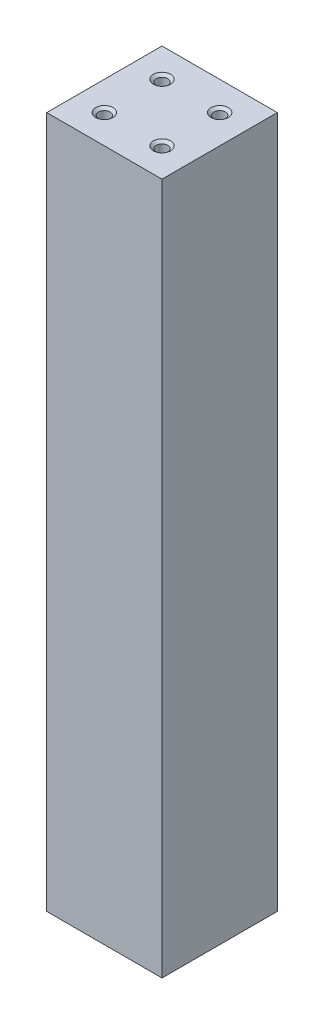
ISO-10303-21;
HEADER;
FILE_DESCRIPTION(('STEP AP214'),'2;1');
FILE_NAME('part.step','',(''),(''),'','','');
FILE_SCHEMA(('AUTOMOTIVE_DESIGN { 1 0 10303 214 1 1 1 1 }'));
ENDSEC;
DATA;
#1=APPLICATION_CONTEXT('core data for automotive mechanical design processes');
#2=APPLICATION_PROTOCOL_DEFINITION('international standard','automotive_design',2000,#1);
#3=PRODUCT_CONTEXT('',#1,'mechanical');
#4=PRODUCT('Part','Part','',(#3));
#5=PRODUCT_RELATED_PRODUCT_CATEGORY('part','',(#4));
#6=PRODUCT_DEFINITION_FORMATION('','',#4);
#7=PRODUCT_DEFINITION_CONTEXT('part definition',#1,'design');
#8=PRODUCT_DEFINITION('design','',#6,#7);
#9=PRODUCT_DEFINITION_SHAPE('','',#8);
#10=(LENGTH_UNIT() NAMED_UNIT(*) SI_UNIT(.MILLI.,.METRE.));
#11=(NAMED_UNIT(*) PLANE_ANGLE_UNIT() SI_UNIT($,.RADIAN.));
#12=(NAMED_UNIT(*) SI_UNIT($,.STERADIAN.) SOLID_ANGLE_UNIT());
#13=UNCERTAINTY_MEASURE_WITH_UNIT(LENGTH_MEASURE(1.E-05),#10,'distance_accuracy_value','');
#14=(GEOMETRIC_REPRESENTATION_CONTEXT(3) GLOBAL_UNCERTAINTY_ASSIGNED_CONTEXT((#13)) GLOBAL_UNIT_ASSIGNED_CONTEXT((#10,
#11,#12)) REPRESENTATION_CONTEXT('',''));
#15=CARTESIAN_POINT('',(0.,0.,0.));
#16=DIRECTION('',(0.,0.,1.));
#17=DIRECTION('',(1.,0.,0.));
#18=AXIS2_PLACEMENT_3D('',#15,#16,#17);
#19=CARTESIAN_POINT('',(25.4,304.8,25.4));
#20=DIRECTION('',(-1.,0.,0.));
#21=DIRECTION('',(0.,0.,1.));
#22=AXIS2_PLACEMENT_3D('',#19,#20,#21);
#23=PLANE('',#22);
#24=DIRECTION('',(0.,0.,-1.));
#25=VECTOR('',#24,1.);
#26=CARTESIAN_POINT('',(25.4,0.,25.4));
#27=LINE('',#26,#25);
#28=CARTESIAN_POINT('',(25.4,0.,25.4));
#29=VERTEX_POINT('',#28);
#30=CARTESIAN_POINT('',(25.4,0.,-25.4));
#31=VERTEX_POINT('',#30);
#32=EDGE_CURVE('E187',#29,#31,#27,.T.);
#33=ORIENTED_EDGE('',*,*,#32,.T.);
#34=DIRECTION('',(0.,-1.,0.));
#35=VECTOR('',#34,1.);
#36=CARTESIAN_POINT('',(25.4,304.8,-25.4));
#37=LINE('',#36,#35);
#38=CARTESIAN_POINT('',(25.4,304.8,-25.4));
#39=VERTEX_POINT('',#38);
#40=EDGE_CURVE('E11',#39,#31,#37,.T.);
#41=ORIENTED_EDGE('',*,*,#40,.F.);
#42=DIRECTION('',(0.,0.,-1.));
#43=VECTOR('',#42,1.);
#44=CARTESIAN_POINT('',(25.4,304.8,25.4));
#45=LINE('',#44,#43);
#46=CARTESIAN_POINT('',(25.4,304.8,25.4));
#47=VERTEX_POINT('',#46);
#48=EDGE_CURVE('E188',#47,#39,#45,.T.);
#49=ORIENTED_EDGE('',*,*,#48,.F.);
#50=DIRECTION('',(0.,-1.,0.));
#51=VECTOR('',#50,1.);
#52=CARTESIAN_POINT('',(25.4,304.8,25.4));
#53=LINE('',#52,#51);
#54=EDGE_CURVE('E194',#47,#29,#53,.T.);
#55=ORIENTED_EDGE('',*,*,#54,.T.);
#56=EDGE_LOOP('',(#33,#41,#49,#55));
#57=FACE_BOUND('',#56,.T.);
#58=ADVANCED_FACE('F35',(#57),#23,.F.);
#59=CARTESIAN_POINT('',(-25.4,304.8,-25.4));
#60=DIRECTION('',(0.,0.,1.));
#61=DIRECTION('',(1.,0.,0.));
#62=AXIS2_PLACEMENT_3D('',#59,#60,#61);
#63=PLANE('',#62);
#64=DIRECTION('',(-1.,0.,0.));
#65=VECTOR('',#64,1.);
#66=CARTESIAN_POINT('',(-25.4,0.,-25.4));
#67=LINE('',#66,#65);
#68=CARTESIAN_POINT('',(-25.4,0.,-25.4));
#69=VERTEX_POINT('',#68);
#70=EDGE_CURVE('E197',#31,#69,#67,.T.);
#71=ORIENTED_EDGE('',*,*,#70,.T.);
#72=DIRECTION('',(0.,-1.,0.));
#73=VECTOR('',#72,1.);
#74=CARTESIAN_POINT('',(-25.4,304.8,-25.4));
#75=LINE('',#74,#73);
#76=CARTESIAN_POINT('',(-25.4,304.8,-25.4));
#77=VERTEX_POINT('',#76);
#78=EDGE_CURVE('E43',#77,#69,#75,.T.);
#79=ORIENTED_EDGE('',*,*,#78,.F.);
#80=DIRECTION('',(-1.,0.,0.));
#81=VECTOR('',#80,1.);
#82=CARTESIAN_POINT('',(-25.4,304.8,-25.4));
#83=LINE('',#82,#81);
#84=EDGE_CURVE('E82',#39,#77,#83,.T.);
#85=ORIENTED_EDGE('',*,*,#84,.F.);
#86=ORIENTED_EDGE('',*,*,#40,.T.);
#87=EDGE_LOOP('',(#71,#79,#85,#86));
#88=FACE_BOUND('',#87,.T.);
#89=ADVANCED_FACE('F221',(#88),#63,.F.);
#90=CARTESIAN_POINT('',(-25.4,304.8,25.4));
#91=DIRECTION('',(1.,0.,0.));
#92=DIRECTION('',(0.,0.,-1.));
#93=AXIS2_PLACEMENT_3D('',#90,#91,#92);
#94=PLANE('',#93);
#95=DIRECTION('',(0.,0.,1.));
#96=VECTOR('',#95,1.);
#97=CARTESIAN_POINT('',(-25.4,0.,25.4));
#98=LINE('',#97,#96);
#99=CARTESIAN_POINT('',(-25.4,0.,25.4));
#100=VERTEX_POINT('',#99);
#101=EDGE_CURVE('E69',#69,#100,#98,.T.);
#102=ORIENTED_EDGE('',*,*,#101,.T.);
#103=DIRECTION('',(0.,-1.,0.));
#104=VECTOR('',#103,1.);
#105=CARTESIAN_POINT('',(-25.4,304.8,25.4));
#106=LINE('',#105,#104);
#107=CARTESIAN_POINT('',(-25.4,304.8,25.4));
#108=VERTEX_POINT('',#107);
#109=EDGE_CURVE('E202',#108,#100,#106,.T.);
#110=ORIENTED_EDGE('',*,*,#109,.F.);
#111=DIRECTION('',(0.,0.,1.));
#112=VECTOR('',#111,1.);
#113=CARTESIAN_POINT('',(-25.4,304.8,25.4));
#114=LINE('',#113,#112);
#115=EDGE_CURVE('E191',#77,#108,#114,.T.);
#116=ORIENTED_EDGE('',*,*,#115,.F.);
#117=ORIENTED_EDGE('',*,*,#78,.T.);
#118=EDGE_LOOP('',(#102,#110,#116,#117));
#119=FACE_BOUND('',#118,.T.);
#120=ADVANCED_FACE('F204',(#119),#94,.F.);
#121=CARTESIAN_POINT('',(-25.4,304.8,25.4));
#122=DIRECTION('',(0.,0.,-1.));
#123=DIRECTION('',(-1.,0.,0.));
#124=AXIS2_PLACEMENT_3D('',#121,#122,#123);
#125=PLANE('',#124);
#126=DIRECTION('',(1.,0.,0.));
#127=VECTOR('',#126,1.);
#128=CARTESIAN_POINT('',(-25.4,0.,25.4));
#129=LINE('',#128,#127);
#130=EDGE_CURVE('E75',#100,#29,#129,.T.);
#131=ORIENTED_EDGE('',*,*,#130,.T.);
#132=ORIENTED_EDGE('',*,*,#54,.F.);
#133=DIRECTION('',(1.,0.,0.));
#134=VECTOR('',#133,1.);
#135=CARTESIAN_POINT('',(-25.4,304.8,25.4));
#136=LINE('',#135,#134);
#137=EDGE_CURVE('E51',#108,#47,#136,.T.);
#138=ORIENTED_EDGE('',*,*,#137,.F.);
#139=ORIENTED_EDGE('',*,*,#109,.T.);
#140=EDGE_LOOP('',(#131,#132,#138,#139));
#141=FACE_BOUND('',#140,.T.);
#142=ADVANCED_FACE('F211',(#141),#125,.F.);
#143=CARTESIAN_POINT('',(0.,304.8,0.));
#144=DIRECTION('',(0.,-1.,0.));
#145=DIRECTION('',(0.,0.,-1.));
#146=AXIS2_PLACEMENT_3D('',#143,#144,#145);
#147=PLANE('',#146);
#148=CARTESIAN_POINT('',(-12.7,304.8,-12.7));
#149=DIRECTION('',(0.,1.,0.));
#150=DIRECTION('',(0.,0.,1.));
#151=AXIS2_PLACEMENT_3D('',#148,#149,#150);
#152=CIRCLE('',#151,3.81);
#153=CARTESIAN_POINT('',(-12.7,304.8,-8.89));
#154=VERTEX_POINT('',#153);
#155=EDGE_CURVE('E151',#154,#154,#152,.T.);
#156=ORIENTED_EDGE('',*,*,#155,.F.);
#157=EDGE_LOOP('',(#156));
#158=FACE_BOUND('',#157,.T.);
#159=CARTESIAN_POINT('',(12.7,304.8,-12.7));
#160=DIRECTION('',(0.,1.,0.));
#161=DIRECTION('',(0.,0.,1.));
#162=AXIS2_PLACEMENT_3D('',#159,#160,#161);
#163=CIRCLE('',#162,3.81);
#164=CARTESIAN_POINT('',(12.7,304.8,-8.89));
#165=VERTEX_POINT('',#164);
#166=EDGE_CURVE('E160',#165,#165,#163,.T.);
#167=ORIENTED_EDGE('',*,*,#166,.F.);
#168=EDGE_LOOP('',(#167));
#169=FACE_BOUND('',#168,.T.);
#170=CARTESIAN_POINT('',(12.7,304.8,12.7));
#171=DIRECTION('',(0.,1.,0.));
#172=DIRECTION('',(0.,0.,1.));
#173=AXIS2_PLACEMENT_3D('',#170,#171,#172);
#174=CIRCLE('',#173,3.81);
#175=CARTESIAN_POINT('',(12.7,304.8,16.51));
#176=VERTEX_POINT('',#175);
#177=EDGE_CURVE('E169',#176,#176,#174,.T.);
#178=ORIENTED_EDGE('',*,*,#177,.F.);
#179=EDGE_LOOP('',(#178));
#180=FACE_BOUND('',#179,.T.);
#181=CARTESIAN_POINT('',(-12.7,304.8,12.7));
#182=DIRECTION('',(0.,1.,0.));
#183=DIRECTION('',(0.,0.,1.));
#184=AXIS2_PLACEMENT_3D('',#181,#182,#183);
#185=CIRCLE('',#184,3.81);
#186=CARTESIAN_POINT('',(-12.7,304.8,16.51));
#187=VERTEX_POINT('',#186);
#188=EDGE_CURVE('E178',#187,#187,#185,.T.);
#189=ORIENTED_EDGE('',*,*,#188,.F.);
#190=EDGE_LOOP('',(#189));
#191=FACE_BOUND('',#190,.T.);
#192=ORIENTED_EDGE('',*,*,#48,.T.);
#193=ORIENTED_EDGE('',*,*,#84,.T.);
#194=ORIENTED_EDGE('',*,*,#115,.T.);
#195=ORIENTED_EDGE('',*,*,#137,.T.);
#196=EDGE_LOOP('',(#192,#193,#194,#195));
#197=FACE_BOUND('',#196,.T.);
#198=ADVANCED_FACE('F213',(#158,#169,#180,#191,#197),#147,.F.);
#199=CARTESIAN_POINT('',(0.,0.,0.));
#200=DIRECTION('',(0.,-1.,0.));
#201=DIRECTION('',(0.,0.,-1.));
#202=AXIS2_PLACEMENT_3D('',#199,#200,#201);
#203=PLANE('',#202);
#204=CARTESIAN_POINT('',(-12.7,0.,-12.7));
#205=DIRECTION('',(0.,-1.,0.));
#206=DIRECTION('',(0.,0.,-1.));
#207=AXIS2_PLACEMENT_3D('',#204,#205,#206);
#208=CIRCLE('',#207,3.81);
#209=CARTESIAN_POINT('',(-12.7,0.,-16.51));
#210=VERTEX_POINT('',#209);
#211=EDGE_CURVE('E124',#210,#210,#208,.T.);
#212=ORIENTED_EDGE('',*,*,#211,.F.);
#213=EDGE_LOOP('',(#212));
#214=FACE_BOUND('',#213,.T.);
#215=CARTESIAN_POINT('',(12.7,0.,-12.7));
#216=DIRECTION('',(0.,-1.,0.));
#217=DIRECTION('',(0.,0.,-1.));
#218=AXIS2_PLACEMENT_3D('',#215,#216,#217);
#219=CIRCLE('',#218,3.81);
#220=CARTESIAN_POINT('',(12.7,0.,-16.51));
#221=VERTEX_POINT('',#220);
#222=EDGE_CURVE('E117',#221,#221,#219,.T.);
#223=ORIENTED_EDGE('',*,*,#222,.F.);
#224=EDGE_LOOP('',(#223));
#225=FACE_BOUND('',#224,.T.);
#226=CARTESIAN_POINT('',(12.7,0.,12.7));
#227=DIRECTION('',(0.,-1.,0.));
#228=DIRECTION('',(0.,0.,-1.));
#229=AXIS2_PLACEMENT_3D('',#226,#227,#228);
#230=CIRCLE('',#229,3.81);
#231=CARTESIAN_POINT('',(12.7,0.,8.89));
#232=VERTEX_POINT('',#231);
#233=EDGE_CURVE('E133',#232,#232,#230,.T.);
#234=ORIENTED_EDGE('',*,*,#233,.F.);
#235=EDGE_LOOP('',(#234));
#236=FACE_BOUND('',#235,.T.);
#237=CARTESIAN_POINT('',(-12.7,0.,12.7));
#238=DIRECTION('',(0.,-1.,0.));
#239=DIRECTION('',(0.,0.,-1.));
#240=AXIS2_PLACEMENT_3D('',#237,#238,#239);
#241=CIRCLE('',#240,3.81);
#242=CARTESIAN_POINT('',(-12.7,0.,8.89));
#243=VERTEX_POINT('',#242);
#244=EDGE_CURVE('E142',#243,#243,#241,.T.);
#245=ORIENTED_EDGE('',*,*,#244,.F.);
#246=EDGE_LOOP('',(#245));
#247=FACE_BOUND('',#246,.T.);
#248=ORIENTED_EDGE('',*,*,#32,.F.);
#249=ORIENTED_EDGE('',*,*,#130,.F.);
#250=ORIENTED_EDGE('',*,*,#101,.F.);
#251=ORIENTED_EDGE('',*,*,#70,.F.);
#252=EDGE_LOOP('',(#248,#249,#250,#251));
#253=FACE_BOUND('',#252,.T.);
#254=ADVANCED_FACE('F207',(#214,#225,#236,#247,#253),#203,.T.);
#255=CARTESIAN_POINT('',(-12.7,279.4,12.7));
#256=DIRECTION('',(0.,1.,0.));
#257=DIRECTION('',(0.,0.,1.));
#258=AXIS2_PLACEMENT_3D('',#255,#256,#257);
#259=CONICAL_SURFACE('',#258,2.5527,1.02974425867665);
#260=CARTESIAN_POINT('',(-12.7,277.866183097808,12.7));
#261=VERTEX_POINT('',#260);
#262=VERTEX_LOOP('',#261);
#263=FACE_BOUND('',#262,.T.);
#264=CARTESIAN_POINT('',(-12.7,279.4,12.7));
#265=DIRECTION('',(0.,1.,0.));
#266=DIRECTION('',(0.,0.,1.));
#267=AXIS2_PLACEMENT_3D('',#264,#265,#266);
#268=CIRCLE('',#267,2.5527);
#269=CARTESIAN_POINT('',(-12.7,279.4,15.2527));
#270=VERTEX_POINT('',#269);
#271=EDGE_CURVE('E184',#270,#270,#268,.T.);
#272=ORIENTED_EDGE('',*,*,#271,.T.);
#273=EDGE_LOOP('',(#272));
#274=FACE_BOUND('',#273,.T.);
#275=ADVANCED_FACE('F251',(#263,#274),#259,.F.);
#276=CARTESIAN_POINT('',(-12.7,304.8,12.7));
#277=DIRECTION('',(0.,1.,0.));
#278=DIRECTION('',(0.,0.,1.));
#279=AXIS2_PLACEMENT_3D('',#276,#277,#278);
#280=CYLINDRICAL_SURFACE('',#279,2.5527);
#281=ORIENTED_EDGE('',*,*,#271,.F.);
#282=EDGE_LOOP('',(#281));
#283=FACE_BOUND('',#282,.T.);
#284=CARTESIAN_POINT('',(-12.7,303.745000033721,12.7));
#285=DIRECTION('',(0.,1.,0.));
#286=DIRECTION('',(0.,0.,1.));
#287=AXIS2_PLACEMENT_3D('',#284,#285,#286);
#288=CIRCLE('',#287,2.5527);
#289=CARTESIAN_POINT('',(-12.7,303.745000033721,15.2527));
#290=VERTEX_POINT('',#289);
#291=EDGE_CURVE('E181',#290,#290,#288,.T.);
#292=ORIENTED_EDGE('',*,*,#291,.T.);
#293=EDGE_LOOP('',(#292));
#294=FACE_BOUND('',#293,.T.);
#295=ADVANCED_FACE('F256',(#283,#294),#280,.F.);
#296=CARTESIAN_POINT('',(-12.7,304.8,12.7));
#297=DIRECTION('',(0.,1.,0.));
#298=DIRECTION('',(0.,0.,1.));
#299=AXIS2_PLACEMENT_3D('',#296,#297,#298);
#300=CONICAL_SURFACE('',#299,3.81,0.872664625997176);
#301=ORIENTED_EDGE('',*,*,#291,.F.);
#302=EDGE_LOOP('',(#301));
#303=FACE_BOUND('',#302,.T.);
#304=ORIENTED_EDGE('',*,*,#188,.T.);
#305=EDGE_LOOP('',(#304));
#306=FACE_BOUND('',#305,.T.);
#307=ADVANCED_FACE('F267',(#303,#306),#300,.F.);
#308=CARTESIAN_POINT('',(12.7,279.4,12.7));
#309=DIRECTION('',(0.,1.,0.));
#310=DIRECTION('',(0.,0.,1.));
#311=AXIS2_PLACEMENT_3D('',#308,#309,#310);
#312=CONICAL_SURFACE('',#311,2.5527,1.02974425867665);
#313=CARTESIAN_POINT('',(12.7,277.866183097808,12.7));
#314=VERTEX_POINT('',#313);
#315=VERTEX_LOOP('',#314);
#316=FACE_BOUND('',#315,.T.);
#317=CARTESIAN_POINT('',(12.7,279.4,12.7));
#318=DIRECTION('',(0.,1.,0.));
#319=DIRECTION('',(0.,0.,1.));
#320=AXIS2_PLACEMENT_3D('',#317,#318,#319);
#321=CIRCLE('',#320,2.5527);
#322=CARTESIAN_POINT('',(12.7,279.4,15.2527));
#323=VERTEX_POINT('',#322);
#324=EDGE_CURVE('E175',#323,#323,#321,.T.);
#325=ORIENTED_EDGE('',*,*,#324,.T.);
#326=EDGE_LOOP('',(#325));
#327=FACE_BOUND('',#326,.T.);
#328=ADVANCED_FACE('F279',(#316,#327),#312,.F.);
#329=CARTESIAN_POINT('',(12.7,304.8,12.7));
#330=DIRECTION('',(0.,1.,0.));
#331=DIRECTION('',(0.,0.,1.));
#332=AXIS2_PLACEMENT_3D('',#329,#330,#331);
#333=CYLINDRICAL_SURFACE('',#332,2.5527);
#334=ORIENTED_EDGE('',*,*,#324,.F.);
#335=EDGE_LOOP('',(#334));
#336=FACE_BOUND('',#335,.T.);
#337=CARTESIAN_POINT('',(12.7,303.745000033721,12.7));
#338=DIRECTION('',(0.,1.,0.));
#339=DIRECTION('',(0.,0.,1.));
#340=AXIS2_PLACEMENT_3D('',#337,#338,#339);
#341=CIRCLE('',#340,2.5527);
#342=CARTESIAN_POINT('',(12.7,303.745000033721,15.2527));
#343=VERTEX_POINT('',#342);
#344=EDGE_CURVE('E172',#343,#343,#341,.T.);
#345=ORIENTED_EDGE('',*,*,#344,.T.);
#346=EDGE_LOOP('',(#345));
#347=FACE_BOUND('',#346,.T.);
#348=ADVANCED_FACE('F289',(#336,#347),#333,.F.);
#349=CARTESIAN_POINT('',(12.7,304.8,12.7));
#350=DIRECTION('',(0.,1.,0.));
#351=DIRECTION('',(0.,0.,1.));
#352=AXIS2_PLACEMENT_3D('',#349,#350,#351);
#353=CONICAL_SURFACE('',#352,3.81,0.872664625997176);
#354=ORIENTED_EDGE('',*,*,#344,.F.);
#355=EDGE_LOOP('',(#354));
#356=FACE_BOUND('',#355,.T.);
#357=ORIENTED_EDGE('',*,*,#177,.T.);
#358=EDGE_LOOP('',(#357));
#359=FACE_BOUND('',#358,.T.);
#360=ADVANCED_FACE('F299',(#356,#359),#353,.F.);
#361=CARTESIAN_POINT('',(12.7,279.4,-12.7));
#362=DIRECTION('',(0.,1.,0.));
#363=DIRECTION('',(0.,0.,1.));
#364=AXIS2_PLACEMENT_3D('',#361,#362,#363);
#365=CONICAL_SURFACE('',#364,2.5527,1.02974425867665);
#366=CARTESIAN_POINT('',(12.7,277.866183097808,-12.7));
#367=VERTEX_POINT('',#366);
#368=VERTEX_LOOP('',#367);
#369=FACE_BOUND('',#368,.T.);
#370=CARTESIAN_POINT('',(12.7,279.4,-12.7));
#371=DIRECTION('',(0.,1.,0.));
#372=DIRECTION('',(0.,0.,1.));
#373=AXIS2_PLACEMENT_3D('',#370,#371,#372);
#374=CIRCLE('',#373,2.5527);
#375=CARTESIAN_POINT('',(12.7,279.4,-10.1473));
#376=VERTEX_POINT('',#375);
#377=EDGE_CURVE('E166',#376,#376,#374,.T.);
#378=ORIENTED_EDGE('',*,*,#377,.T.);
#379=EDGE_LOOP('',(#378));
#380=FACE_BOUND('',#379,.T.);
#381=ADVANCED_FACE('F310',(#369,#380),#365,.F.);
#382=CARTESIAN_POINT('',(12.7,304.8,-12.7));
#383=DIRECTION('',(0.,1.,0.));
#384=DIRECTION('',(0.,0.,1.));
#385=AXIS2_PLACEMENT_3D('',#382,#383,#384);
#386=CYLINDRICAL_SURFACE('',#385,2.5527);
#387=ORIENTED_EDGE('',*,*,#377,.F.);
#388=EDGE_LOOP('',(#387));
#389=FACE_BOUND('',#388,.T.);
#390=CARTESIAN_POINT('',(12.7,303.745000033721,-12.7));
#391=DIRECTION('',(0.,1.,0.));
#392=DIRECTION('',(0.,0.,1.));
#393=AXIS2_PLACEMENT_3D('',#390,#391,#392);
#394=CIRCLE('',#393,2.5527);
#395=CARTESIAN_POINT('',(12.7,303.745000033721,-10.1473));
#396=VERTEX_POINT('',#395);
#397=EDGE_CURVE('E163',#396,#396,#394,.T.);
#398=ORIENTED_EDGE('',*,*,#397,.T.);
#399=EDGE_LOOP('',(#398));
#400=FACE_BOUND('',#399,.T.);
#401=ADVANCED_FACE('F320',(#389,#400),#386,.F.);
#402=CARTESIAN_POINT('',(12.7,304.8,-12.7));
#403=DIRECTION('',(0.,1.,0.));
#404=DIRECTION('',(0.,0.,1.));
#405=AXIS2_PLACEMENT_3D('',#402,#403,#404);
#406=CONICAL_SURFACE('',#405,3.81,0.872664625997178);
#407=ORIENTED_EDGE('',*,*,#397,.F.);
#408=EDGE_LOOP('',(#407));
#409=FACE_BOUND('',#408,.T.);
#410=ORIENTED_EDGE('',*,*,#166,.T.);
#411=EDGE_LOOP('',(#410));
#412=FACE_BOUND('',#411,.T.);
#413=ADVANCED_FACE('F330',(#409,#412),#406,.F.);
#414=CARTESIAN_POINT('',(-12.7,279.4,-12.7));
#415=DIRECTION('',(0.,1.,0.));
#416=DIRECTION('',(0.,0.,1.));
#417=AXIS2_PLACEMENT_3D('',#414,#415,#416);
#418=CONICAL_SURFACE('',#417,2.5527,1.02974425867665);
#419=CARTESIAN_POINT('',(-12.7,277.866183097808,-12.7));
#420=VERTEX_POINT('',#419);
#421=VERTEX_LOOP('',#420);
#422=FACE_BOUND('',#421,.T.);
#423=CARTESIAN_POINT('',(-12.7,279.4,-12.7));
#424=DIRECTION('',(0.,1.,0.));
#425=DIRECTION('',(0.,0.,1.));
#426=AXIS2_PLACEMENT_3D('',#423,#424,#425);
#427=CIRCLE('',#426,2.5527);
#428=CARTESIAN_POINT('',(-12.7,279.4,-10.1473));
#429=VERTEX_POINT('',#428);
#430=EDGE_CURVE('E157',#429,#429,#427,.T.);
#431=ORIENTED_EDGE('',*,*,#430,.T.);
#432=EDGE_LOOP('',(#431));
#433=FACE_BOUND('',#432,.T.);
#434=ADVANCED_FACE('F341',(#422,#433),#418,.F.);
#435=CARTESIAN_POINT('',(-12.7,304.8,-12.7));
#436=DIRECTION('',(0.,1.,0.));
#437=DIRECTION('',(0.,0.,1.));
#438=AXIS2_PLACEMENT_3D('',#435,#436,#437);
#439=CYLINDRICAL_SURFACE('',#438,2.5527);
#440=ORIENTED_EDGE('',*,*,#430,.F.);
#441=EDGE_LOOP('',(#440));
#442=FACE_BOUND('',#441,.T.);
#443=CARTESIAN_POINT('',(-12.7,303.745000033721,-12.7));
#444=DIRECTION('',(0.,1.,0.));
#445=DIRECTION('',(0.,0.,1.));
#446=AXIS2_PLACEMENT_3D('',#443,#444,#445);
#447=CIRCLE('',#446,2.5527);
#448=CARTESIAN_POINT('',(-12.7,303.745000033721,-10.1473));
#449=VERTEX_POINT('',#448);
#450=EDGE_CURVE('E154',#449,#449,#447,.T.);
#451=ORIENTED_EDGE('',*,*,#450,.T.);
#452=EDGE_LOOP('',(#451));
#453=FACE_BOUND('',#452,.T.);
#454=ADVANCED_FACE('F351',(#442,#453),#439,.F.);
#455=CARTESIAN_POINT('',(-12.7,304.8,-12.7));
#456=DIRECTION('',(0.,1.,0.));
#457=DIRECTION('',(0.,0.,1.));
#458=AXIS2_PLACEMENT_3D('',#455,#456,#457);
#459=CONICAL_SURFACE('',#458,3.81,0.872664625997176);
#460=ORIENTED_EDGE('',*,*,#450,.F.);
#461=EDGE_LOOP('',(#460));
#462=FACE_BOUND('',#461,.T.);
#463=ORIENTED_EDGE('',*,*,#155,.T.);
#464=EDGE_LOOP('',(#463));
#465=FACE_BOUND('',#464,.T.);
#466=ADVANCED_FACE('F361',(#462,#465),#459,.F.);
#467=CARTESIAN_POINT('',(-12.7,25.4,12.7));
#468=DIRECTION('',(0.,-1.,0.));
#469=DIRECTION('',(0.,0.,-1.));
#470=AXIS2_PLACEMENT_3D('',#467,#468,#469);
#471=CONICAL_SURFACE('',#470,2.5527,1.02974425867665);
#472=CARTESIAN_POINT('',(-12.7,26.9338169021917,12.7));
#473=VERTEX_POINT('',#472);
#474=VERTEX_LOOP('',#473);
#475=FACE_BOUND('',#474,.T.);
#476=CARTESIAN_POINT('',(-12.7,25.4,12.7));
#477=DIRECTION('',(0.,-1.,0.));
#478=DIRECTION('',(0.,0.,-1.));
#479=AXIS2_PLACEMENT_3D('',#476,#477,#478);
#480=CIRCLE('',#479,2.5527);
#481=CARTESIAN_POINT('',(-12.7,25.4,10.1473));
#482=VERTEX_POINT('',#481);
#483=EDGE_CURVE('E148',#482,#482,#480,.T.);
#484=ORIENTED_EDGE('',*,*,#483,.T.);
#485=EDGE_LOOP('',(#484));
#486=FACE_BOUND('',#485,.T.);
#487=ADVANCED_FACE('F371',(#475,#486),#471,.F.);
#488=CARTESIAN_POINT('',(-12.7,0.,12.7));
#489=DIRECTION('',(0.,-1.,0.));
#490=DIRECTION('',(0.,0.,-1.));
#491=AXIS2_PLACEMENT_3D('',#488,#489,#490);
#492=CYLINDRICAL_SURFACE('',#491,2.5527);
#493=ORIENTED_EDGE('',*,*,#483,.F.);
#494=EDGE_LOOP('',(#493));
#495=FACE_BOUND('',#494,.T.);
#496=CARTESIAN_POINT('',(-12.7,1.05499996627919,12.7));
#497=DIRECTION('',(0.,-1.,0.));
#498=DIRECTION('',(0.,0.,-1.));
#499=AXIS2_PLACEMENT_3D('',#496,#497,#498);
#500=CIRCLE('',#499,2.5527);
#501=CARTESIAN_POINT('',(-12.7,1.05499996627919,10.1473));
#502=VERTEX_POINT('',#501);
#503=EDGE_CURVE('E145',#502,#502,#500,.T.);
#504=ORIENTED_EDGE('',*,*,#503,.T.);
#505=EDGE_LOOP('',(#504));
#506=FACE_BOUND('',#505,.T.);
#507=ADVANCED_FACE('F387',(#495,#506),#492,.F.);
#508=CARTESIAN_POINT('',(-12.7,0.,12.7));
#509=DIRECTION('',(0.,-1.,0.));
#510=DIRECTION('',(0.,0.,-1.));
#511=AXIS2_PLACEMENT_3D('',#508,#509,#510);
#512=CONICAL_SURFACE('',#511,3.81,0.872664625997163);
#513=ORIENTED_EDGE('',*,*,#503,.F.);
#514=EDGE_LOOP('',(#513));
#515=FACE_BOUND('',#514,.T.);
#516=ORIENTED_EDGE('',*,*,#244,.T.);
#517=EDGE_LOOP('',(#516));
#518=FACE_BOUND('',#517,.T.);
#519=ADVANCED_FACE('F397',(#515,#518),#512,.F.);
#520=CARTESIAN_POINT('',(12.7,25.4,12.7));
#521=DIRECTION('',(0.,-1.,0.));
#522=DIRECTION('',(0.,0.,-1.));
#523=AXIS2_PLACEMENT_3D('',#520,#521,#522);
#524=CONICAL_SURFACE('',#523,2.5527,1.02974425867665);
#525=CARTESIAN_POINT('',(12.7,26.9338169021917,12.7));
#526=VERTEX_POINT('',#525);
#527=VERTEX_LOOP('',#526);
#528=FACE_BOUND('',#527,.T.);
#529=CARTESIAN_POINT('',(12.7,25.4,12.7));
#530=DIRECTION('',(0.,-1.,0.));
#531=DIRECTION('',(0.,0.,-1.));
#532=AXIS2_PLACEMENT_3D('',#529,#530,#531);
#533=CIRCLE('',#532,2.5527);
#534=CARTESIAN_POINT('',(12.7,25.4,10.1473));
#535=VERTEX_POINT('',#534);
#536=EDGE_CURVE('E139',#535,#535,#533,.T.);
#537=ORIENTED_EDGE('',*,*,#536,.T.);
#538=EDGE_LOOP('',(#537));
#539=FACE_BOUND('',#538,.T.);
#540=ADVANCED_FACE('F408',(#528,#539),#524,.F.);
#541=CARTESIAN_POINT('',(12.7,0.,12.7));
#542=DIRECTION('',(0.,-1.,0.));
#543=DIRECTION('',(0.,0.,-1.));
#544=AXIS2_PLACEMENT_3D('',#541,#542,#543);
#545=CYLINDRICAL_SURFACE('',#544,2.5527);
#546=ORIENTED_EDGE('',*,*,#536,.F.);
#547=EDGE_LOOP('',(#546));
#548=FACE_BOUND('',#547,.T.);
#549=CARTESIAN_POINT('',(12.7,1.05499996627919,12.7));
#550=DIRECTION('',(0.,-1.,0.));
#551=DIRECTION('',(0.,0.,-1.));
#552=AXIS2_PLACEMENT_3D('',#549,#550,#551);
#553=CIRCLE('',#552,2.5527);
#554=CARTESIAN_POINT('',(12.7,1.05499996627919,10.1473));
#555=VERTEX_POINT('',#554);
#556=EDGE_CURVE('E136',#555,#555,#553,.T.);
#557=ORIENTED_EDGE('',*,*,#556,.T.);
#558=EDGE_LOOP('',(#557));
#559=FACE_BOUND('',#558,.T.);
#560=ADVANCED_FACE('F418',(#548,#559),#545,.F.);
#561=CARTESIAN_POINT('',(12.7,0.,12.7));
#562=DIRECTION('',(0.,-1.,0.));
#563=DIRECTION('',(0.,0.,-1.));
#564=AXIS2_PLACEMENT_3D('',#561,#562,#563);
#565=CONICAL_SURFACE('',#564,3.81,0.872664625997163);
#566=ORIENTED_EDGE('',*,*,#556,.F.);
#567=EDGE_LOOP('',(#566));
#568=FACE_BOUND('',#567,.T.);
#569=ORIENTED_EDGE('',*,*,#233,.T.);
#570=EDGE_LOOP('',(#569));
#571=FACE_BOUND('',#570,.T.);
#572=ADVANCED_FACE('F428',(#568,#571),#565,.F.);
#573=CARTESIAN_POINT('',(12.7,25.4,-12.7));
#574=DIRECTION('',(0.,-1.,0.));
#575=DIRECTION('',(0.,0.,-1.));
#576=AXIS2_PLACEMENT_3D('',#573,#574,#575);
#577=CONICAL_SURFACE('',#576,2.5527,1.02974425867665);
#578=CARTESIAN_POINT('',(12.7,26.9338169021917,-12.7));
#579=VERTEX_POINT('',#578);
#580=VERTEX_LOOP('',#579);
#581=FACE_BOUND('',#580,.T.);
#582=CARTESIAN_POINT('',(12.7,25.4,-12.7));
#583=DIRECTION('',(0.,-1.,0.));
#584=DIRECTION('',(0.,0.,-1.));
#585=AXIS2_PLACEMENT_3D('',#582,#583,#584);
#586=CIRCLE('',#585,2.5527);
#587=CARTESIAN_POINT('',(12.7,25.4,-15.2527));
#588=VERTEX_POINT('',#587);
#589=EDGE_CURVE('E130',#588,#588,#586,.T.);
#590=ORIENTED_EDGE('',*,*,#589,.T.);
#591=EDGE_LOOP('',(#590));
#592=FACE_BOUND('',#591,.T.);
#593=ADVANCED_FACE('F439',(#581,#592),#577,.F.);
#594=CARTESIAN_POINT('',(12.7,0.,-12.7));
#595=DIRECTION('',(0.,-1.,0.));
#596=DIRECTION('',(0.,0.,-1.));
#597=AXIS2_PLACEMENT_3D('',#594,#595,#596);
#598=CYLINDRICAL_SURFACE('',#597,2.5527);
#599=ORIENTED_EDGE('',*,*,#589,.F.);
#600=EDGE_LOOP('',(#599));
#601=FACE_BOUND('',#600,.T.);
#602=CARTESIAN_POINT('',(12.7,1.05499996627919,-12.7));
#603=DIRECTION('',(0.,-1.,0.));
#604=DIRECTION('',(0.,0.,-1.));
#605=AXIS2_PLACEMENT_3D('',#602,#603,#604);
#606=CIRCLE('',#605,2.5527);
#607=CARTESIAN_POINT('',(12.7,1.05499996627919,-15.2527));
#608=VERTEX_POINT('',#607);
#609=EDGE_CURVE('E121',#608,#608,#606,.T.);
#610=ORIENTED_EDGE('',*,*,#609,.T.);
#611=EDGE_LOOP('',(#610));
#612=FACE_BOUND('',#611,.T.);
#613=ADVANCED_FACE('F449',(#601,#612),#598,.F.);
#614=CARTESIAN_POINT('',(12.7,0.,-12.7));
#615=DIRECTION('',(0.,-1.,0.));
#616=DIRECTION('',(0.,0.,-1.));
#617=AXIS2_PLACEMENT_3D('',#614,#615,#616);
#618=CONICAL_SURFACE('',#617,3.81,0.872664625997165);
#619=ORIENTED_EDGE('',*,*,#609,.F.);
#620=EDGE_LOOP('',(#619));
#621=FACE_BOUND('',#620,.T.);
#622=ORIENTED_EDGE('',*,*,#222,.T.);
#623=EDGE_LOOP('',(#622));
#624=FACE_BOUND('',#623,.T.);
#625=ADVANCED_FACE('F111',(#621,#624),#618,.F.);
#626=CARTESIAN_POINT('',(-12.7,25.4,-12.7));
#627=DIRECTION('',(0.,-1.,0.));
#628=DIRECTION('',(0.,0.,-1.));
#629=AXIS2_PLACEMENT_3D('',#626,#627,#628);
#630=CONICAL_SURFACE('',#629,2.5527,1.02974425867665);
#631=CARTESIAN_POINT('',(-12.7,26.9338169021917,-12.7));
#632=VERTEX_POINT('',#631);
#633=VERTEX_LOOP('',#632);
#634=FACE_BOUND('',#633,.T.);
#635=CARTESIAN_POINT('',(-12.7,25.4,-12.7));
#636=DIRECTION('',(0.,-1.,0.));
#637=DIRECTION('',(0.,0.,-1.));
#638=AXIS2_PLACEMENT_3D('',#635,#636,#637);
#639=CIRCLE('',#638,2.5527);
#640=CARTESIAN_POINT('',(-12.7,25.4,-15.2527));
#641=VERTEX_POINT('',#640);
#642=EDGE_CURVE('E115',#641,#641,#639,.T.);
#643=ORIENTED_EDGE('',*,*,#642,.T.);
#644=EDGE_LOOP('',(#643));
#645=FACE_BOUND('',#644,.T.);
#646=ADVANCED_FACE('F107',(#634,#645),#630,.F.);
#647=CARTESIAN_POINT('',(-12.7,0.,-12.7));
#648=DIRECTION('',(0.,-1.,0.));
#649=DIRECTION('',(0.,0.,-1.));
#650=AXIS2_PLACEMENT_3D('',#647,#648,#649);
#651=CYLINDRICAL_SURFACE('',#650,2.5527);
#652=ORIENTED_EDGE('',*,*,#642,.F.);
#653=EDGE_LOOP('',(#652));
#654=FACE_BOUND('',#653,.T.);
#655=CARTESIAN_POINT('',(-12.7,1.05499996627919,-12.7));
#656=DIRECTION('',(0.,-1.,0.));
#657=DIRECTION('',(0.,0.,-1.));
#658=AXIS2_PLACEMENT_3D('',#655,#656,#657);
#659=CIRCLE('',#658,2.5527);
#660=CARTESIAN_POINT('',(-12.7,1.05499996627919,-15.2527));
#661=VERTEX_POINT('',#660);
#662=EDGE_CURVE('E118',#661,#661,#659,.T.);
#663=ORIENTED_EDGE('',*,*,#662,.T.);
#664=EDGE_LOOP('',(#663));
#665=FACE_BOUND('',#664,.T.);
#666=ADVANCED_FACE('F110',(#654,#665),#651,.F.);
#667=CARTESIAN_POINT('',(-12.7,0.,-12.7));
#668=DIRECTION('',(0.,-1.,0.));
#669=DIRECTION('',(0.,0.,-1.));
#670=AXIS2_PLACEMENT_3D('',#667,#668,#669);
#671=CONICAL_SURFACE('',#670,3.81,0.872664625997163);
#672=ORIENTED_EDGE('',*,*,#662,.F.);
#673=EDGE_LOOP('',(#672));
#674=FACE_BOUND('',#673,.T.);
#675=ORIENTED_EDGE('',*,*,#211,.T.);
#676=EDGE_LOOP('',(#675));
#677=FACE_BOUND('',#676,.T.);
#678=ADVANCED_FACE('F484',(#674,#677),#671,.F.);
#679=CLOSED_SHELL('',(#58,#89,#120,#142,#198,#254,#275,#295,#307,#328,#348,#360,#381,#401,#413,
#434,#454,#466,#487,#507,#519,#540,#560,#572,#593,#613,#625,#646,#666,#678));
#680=MANIFOLD_SOLID_BREP('B2',#679);
#681=ADVANCED_BREP_SHAPE_REPRESENTATION('',(#18,#680),#14);
#682=SHAPE_DEFINITION_REPRESENTATION(#9,#681);
ENDSEC;
END-ISO-10303-21;
